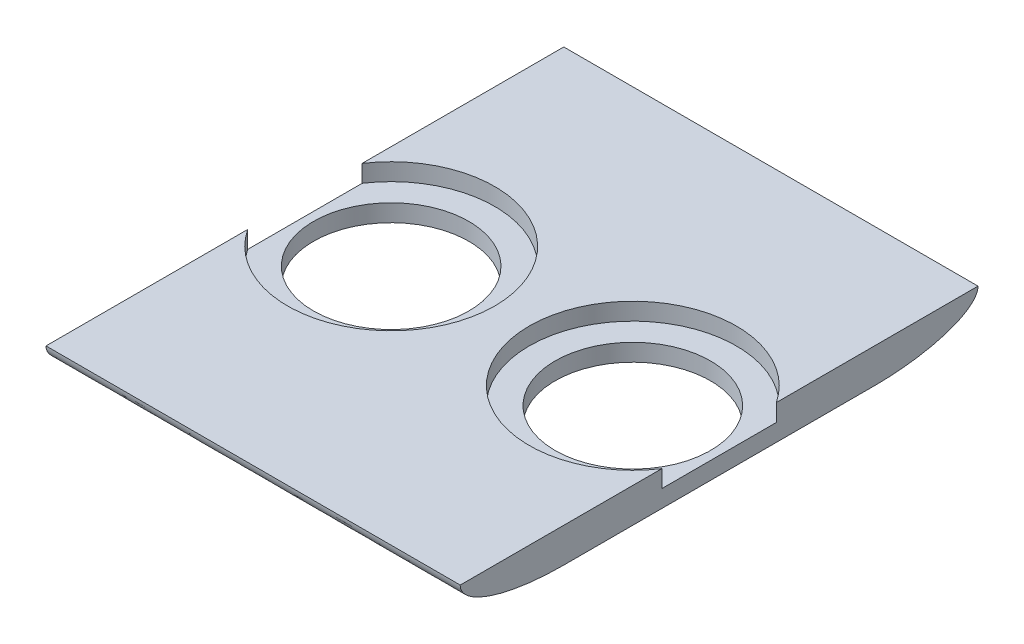
ISO-10303-21;
HEADER;
FILE_DESCRIPTION(('STEP AP214'),'2;1');
FILE_NAME('part.step','',(''),(''),'','','');
FILE_SCHEMA(('AUTOMOTIVE_DESIGN { 1 0 10303 214 1 1 1 1 }'));
ENDSEC;
DATA;
#1=APPLICATION_CONTEXT('core data for automotive mechanical design processes');
#2=APPLICATION_PROTOCOL_DEFINITION('international standard','automotive_design',2000,#1);
#3=PRODUCT_CONTEXT('',#1,'mechanical');
#4=PRODUCT('Part','Part','',(#3));
#5=PRODUCT_RELATED_PRODUCT_CATEGORY('part','',(#4));
#6=PRODUCT_DEFINITION_FORMATION('','',#4);
#7=PRODUCT_DEFINITION_CONTEXT('part definition',#1,'design');
#8=PRODUCT_DEFINITION('design','',#6,#7);
#9=PRODUCT_DEFINITION_SHAPE('','',#8);
#10=(LENGTH_UNIT() NAMED_UNIT(*) SI_UNIT(.MILLI.,.METRE.));
#11=(NAMED_UNIT(*) PLANE_ANGLE_UNIT() SI_UNIT($,.RADIAN.));
#12=(NAMED_UNIT(*) SI_UNIT($,.STERADIAN.) SOLID_ANGLE_UNIT());
#13=UNCERTAINTY_MEASURE_WITH_UNIT(LENGTH_MEASURE(1.E-05),#10,'distance_accuracy_value','');
#14=(GEOMETRIC_REPRESENTATION_CONTEXT(3) GLOBAL_UNCERTAINTY_ASSIGNED_CONTEXT((#13)) GLOBAL_UNIT_ASSIGNED_CONTEXT((#10,
#11,#12)) REPRESENTATION_CONTEXT('',''));
#15=CARTESIAN_POINT('',(0.,0.,0.));
#16=DIRECTION('',(0.,0.,1.));
#17=DIRECTION('',(1.,0.,0.));
#18=AXIS2_PLACEMENT_3D('',#15,#16,#17);
#19=CARTESIAN_POINT('',(60.,10.,75.));
#20=DIRECTION('',(-1.,0.,0.));
#21=DIRECTION('',(0.,0.,1.));
#22=AXIS2_PLACEMENT_3D('',#19,#20,#21);
#23=PLANE('',#22);
#24=DIRECTION('',(0.,0.,-1.));
#25=VECTOR('',#24,1.);
#26=CARTESIAN_POINT('',(60.,0.,75.));
#27=LINE('',#26,#25);
#28=CARTESIAN_POINT('',(60.,0.,45.));
#29=VERTEX_POINT('',#28);
#30=CARTESIAN_POINT('',(60.,0.,-45.));
#31=VERTEX_POINT('',#30);
#32=EDGE_CURVE('E159',#29,#31,#27,.T.);
#33=ORIENTED_EDGE('',*,*,#32,.T.);
#34=CARTESIAN_POINT('',(60.,10.,-75.));
#35=CARTESIAN_POINT('',(60.,0.,-75.));
#36=CARTESIAN_POINT('',(60.,0.,-45.));
#37=(BOUNDED_CURVE() B_SPLINE_CURVE(2,(#34,#35,#36),.UNSPECIFIED.,.F.,
.F.) B_SPLINE_CURVE_WITH_KNOTS((3,3),(0.,1.),
.UNSPECIFIED.) CURVE() GEOMETRIC_REPRESENTATION_ITEM() RATIONAL_B_SPLINE_CURVE((1.,
0.707106781186548,1.)) REPRESENTATION_ITEM(''));
#38=CARTESIAN_POINT('',(60.,10.,-75.));
#39=VERTEX_POINT('',#38);
#40=EDGE_CURVE('E12',#31,#39,#37,.F.);
#41=ORIENTED_EDGE('',*,*,#40,.T.);
#42=DIRECTION('',(0.,0.,-1.));
#43=VECTOR('',#42,1.);
#44=CARTESIAN_POINT('',(60.,10.,75.));
#45=LINE('',#44,#43);
#46=CARTESIAN_POINT('',(60.,10.,-16.583123951777));
#47=VERTEX_POINT('',#46);
#48=EDGE_CURVE('E158',#47,#39,#45,.T.);
#49=ORIENTED_EDGE('',*,*,#48,.F.);
#50=DIRECTION('',(0.,1.,0.));
#51=VECTOR('',#50,1.);
#52=CARTESIAN_POINT('',(60.,5.,-16.583123951777));
#53=LINE('',#52,#51);
#54=CARTESIAN_POINT('',(60.,5.,-16.583123951777));
#55=VERTEX_POINT('',#54);
#56=EDGE_CURVE('E129',#47,#55,#53,.F.);
#57=ORIENTED_EDGE('',*,*,#56,.T.);
#58=DIRECTION('',(0.,0.,-1.));
#59=VECTOR('',#58,1.);
#60=CARTESIAN_POINT('',(60.,5.,75.));
#61=LINE('',#60,#59);
#62=CARTESIAN_POINT('',(60.,5.,16.583123951777));
#63=VERTEX_POINT('',#62);
#64=EDGE_CURVE('E142',#63,#55,#61,.T.);
#65=ORIENTED_EDGE('',*,*,#64,.F.);
#66=DIRECTION('',(0.,1.,0.));
#67=VECTOR('',#66,1.);
#68=CARTESIAN_POINT('',(60.,5.,16.583123951777));
#69=LINE('',#68,#67);
#70=CARTESIAN_POINT('',(60.,10.,16.583123951777));
#71=VERTEX_POINT('',#70);
#72=EDGE_CURVE('E278',#63,#71,#69,.T.);
#73=ORIENTED_EDGE('',*,*,#72,.T.);
#74=CARTESIAN_POINT('',(60.,10.,75.));
#75=VERTEX_POINT('',#74);
#76=EDGE_CURVE('E254',#75,#71,#45,.T.);
#77=ORIENTED_EDGE('',*,*,#76,.F.);
#78=CARTESIAN_POINT('',(60.,0.,45.));
#79=CARTESIAN_POINT('',(60.,0.,75.));
#80=CARTESIAN_POINT('',(60.,10.,75.));
#81=(BOUNDED_CURVE() B_SPLINE_CURVE(2,(#78,#79,#80),.UNSPECIFIED.,.F.,
.F.) B_SPLINE_CURVE_WITH_KNOTS((3,3),(0.,1.),
.UNSPECIFIED.) CURVE() GEOMETRIC_REPRESENTATION_ITEM() RATIONAL_B_SPLINE_CURVE((1.,
0.707106781186548,1.)) REPRESENTATION_ITEM(''));
#82=EDGE_CURVE('E59',#75,#29,#81,.F.);
#83=ORIENTED_EDGE('',*,*,#82,.T.);
#84=EDGE_LOOP('',(#33,#41,#49,#57,#65,#73,#77,#83));
#85=FACE_BOUND('',#84,.T.);
#86=ADVANCED_FACE('F43',(#85),#23,.F.);
#87=CARTESIAN_POINT('',(-60.,10.,75.));
#88=DIRECTION('',(1.,0.,0.));
#89=DIRECTION('',(0.,0.,-1.));
#90=AXIS2_PLACEMENT_3D('',#87,#88,#89);
#91=PLANE('',#90);
#92=DIRECTION('',(0.,0.,1.));
#93=VECTOR('',#92,1.);
#94=CARTESIAN_POINT('',(-60.,10.,75.));
#95=LINE('',#94,#93);
#96=CARTESIAN_POINT('',(-60.,10.,-75.));
#97=VERTEX_POINT('',#96);
#98=CARTESIAN_POINT('',(-60.,10.,-16.583123951777));
#99=VERTEX_POINT('',#98);
#100=EDGE_CURVE('E171',#97,#99,#95,.T.);
#101=ORIENTED_EDGE('',*,*,#100,.F.);
#102=CARTESIAN_POINT('',(-60.,0.,-45.));
#103=CARTESIAN_POINT('',(-60.,0.,-75.));
#104=CARTESIAN_POINT('',(-60.,10.,-75.));
#105=(BOUNDED_CURVE() B_SPLINE_CURVE(2,(#102,#103,#104),.UNSPECIFIED.,.F.,
.F.) B_SPLINE_CURVE_WITH_KNOTS((3,3),(0.,1.),
.UNSPECIFIED.) CURVE() GEOMETRIC_REPRESENTATION_ITEM() RATIONAL_B_SPLINE_CURVE((1.,
0.707106781186548,1.)) REPRESENTATION_ITEM(''));
#106=CARTESIAN_POINT('',(-60.,0.,-45.));
#107=VERTEX_POINT('',#106);
#108=EDGE_CURVE('E195',#97,#107,#105,.F.);
#109=ORIENTED_EDGE('',*,*,#108,.T.);
#110=DIRECTION('',(0.,0.,1.));
#111=VECTOR('',#110,1.);
#112=CARTESIAN_POINT('',(-60.,0.,75.));
#113=LINE('',#112,#111);
#114=CARTESIAN_POINT('',(-60.,0.,45.));
#115=VERTEX_POINT('',#114);
#116=EDGE_CURVE('E153',#107,#115,#113,.T.);
#117=ORIENTED_EDGE('',*,*,#116,.T.);
#118=CARTESIAN_POINT('',(-60.,10.,75.));
#119=CARTESIAN_POINT('',(-60.,0.,75.));
#120=CARTESIAN_POINT('',(-60.,0.,45.));
#121=(BOUNDED_CURVE() B_SPLINE_CURVE(2,(#118,#119,#120),.UNSPECIFIED.,.F.,
.F.) B_SPLINE_CURVE_WITH_KNOTS((3,3),(0.,1.),
.UNSPECIFIED.) CURVE() GEOMETRIC_REPRESENTATION_ITEM() RATIONAL_B_SPLINE_CURVE((1.,
0.707106781186548,1.)) REPRESENTATION_ITEM(''));
#122=CARTESIAN_POINT('',(-60.,10.,75.));
#123=VERTEX_POINT('',#122);
#124=EDGE_CURVE('E147',#115,#123,#121,.F.);
#125=ORIENTED_EDGE('',*,*,#124,.T.);
#126=CARTESIAN_POINT('',(-60.,10.,16.583123951777));
#127=VERTEX_POINT('',#126);
#128=EDGE_CURVE('E175',#127,#123,#95,.T.);
#129=ORIENTED_EDGE('',*,*,#128,.F.);
#130=DIRECTION('',(0.,1.,0.));
#131=VECTOR('',#130,1.);
#132=CARTESIAN_POINT('',(-60.,5.,16.583123951777));
#133=LINE('',#132,#131);
#134=CARTESIAN_POINT('',(-60.,5.,16.583123951777));
#135=VERTEX_POINT('',#134);
#136=EDGE_CURVE('E130',#127,#135,#133,.F.);
#137=ORIENTED_EDGE('',*,*,#136,.T.);
#138=DIRECTION('',(0.,0.,1.));
#139=VECTOR('',#138,1.);
#140=CARTESIAN_POINT('',(-60.,5.,75.));
#141=LINE('',#140,#139);
#142=CARTESIAN_POINT('',(-60.,5.,-16.583123951777));
#143=VERTEX_POINT('',#142);
#144=EDGE_CURVE('E134',#143,#135,#141,.T.);
#145=ORIENTED_EDGE('',*,*,#144,.F.);
#146=DIRECTION('',(0.,1.,0.));
#147=VECTOR('',#146,1.);
#148=CARTESIAN_POINT('',(-60.,5.,-16.583123951777));
#149=LINE('',#148,#147);
#150=EDGE_CURVE('E117',#143,#99,#149,.T.);
#151=ORIENTED_EDGE('',*,*,#150,.T.);
#152=EDGE_LOOP('',(#101,#109,#117,#125,#129,#137,#145,#151));
#153=FACE_BOUND('',#152,.T.);
#154=ADVANCED_FACE('F139',(#153),#91,.F.);
#155=CARTESIAN_POINT('',(0.,10.,0.));
#156=DIRECTION('',(0.,-1.,0.));
#157=DIRECTION('',(0.,0.,-1.));
#158=AXIS2_PLACEMENT_3D('',#155,#156,#157);
#159=PLANE('',#158);
#160=ORIENTED_EDGE('',*,*,#76,.T.);
#161=CARTESIAN_POINT('',(35.,10.,0.));
#162=DIRECTION('',(0.,-1.,0.));
#163=DIRECTION('',(0.,0.,-1.));
#164=AXIS2_PLACEMENT_3D('',#161,#162,#163);
#165=CIRCLE('',#164,30.);
#166=EDGE_CURVE('E143',#71,#47,#165,.T.);
#167=ORIENTED_EDGE('',*,*,#166,.T.);
#168=ORIENTED_EDGE('',*,*,#48,.T.);
#169=CARTESIAN_POINT('',(-66.,10.,-75.));
#170=CARTESIAN_POINT('',(-22.,10.,-75.));
#171=CARTESIAN_POINT('',(22.,10.,-75.));
#172=CARTESIAN_POINT('',(66.,10.,-75.));
#173=(BOUNDED_CURVE() B_SPLINE_CURVE(3,(#169,#170,#171,#172),.UNSPECIFIED.,.F.,
.F.) B_SPLINE_CURVE_WITH_KNOTS((4,4),(-0.006,0.126),
.UNSPECIFIED.) CURVE() GEOMETRIC_REPRESENTATION_ITEM() RATIONAL_B_SPLINE_CURVE((1.,1.,1.,1.)) REPRESENTATION_ITEM(''));
#174=EDGE_CURVE('E179',#39,#97,#173,.F.);
#175=ORIENTED_EDGE('',*,*,#174,.T.);
#176=ORIENTED_EDGE('',*,*,#100,.T.);
#177=CARTESIAN_POINT('',(-35.,10.,0.));
#178=DIRECTION('',(0.,-1.,0.));
#179=DIRECTION('',(0.,0.,-1.));
#180=AXIS2_PLACEMENT_3D('',#177,#178,#179);
#181=CIRCLE('',#180,30.);
#182=EDGE_CURVE('E123',#99,#127,#181,.T.);
#183=ORIENTED_EDGE('',*,*,#182,.T.);
#184=ORIENTED_EDGE('',*,*,#128,.T.);
#185=CARTESIAN_POINT('',(66.,10.,75.));
#186=CARTESIAN_POINT('',(21.9999999999999,10.,75.));
#187=CARTESIAN_POINT('',(-22.,10.,75.));
#188=CARTESIAN_POINT('',(-66.,10.,75.));
#189=(BOUNDED_CURVE() B_SPLINE_CURVE(3,(#185,#186,#187,#188),.UNSPECIFIED.,.F.,
.F.) B_SPLINE_CURVE_WITH_KNOTS((4,4),(-0.126,0.006),
.UNSPECIFIED.) CURVE() GEOMETRIC_REPRESENTATION_ITEM() RATIONAL_B_SPLINE_CURVE((1.,1.,1.,1.)) REPRESENTATION_ITEM(''));
#190=EDGE_CURVE('E166',#123,#75,#189,.F.);
#191=ORIENTED_EDGE('',*,*,#190,.T.);
#192=EDGE_LOOP('',(#160,#167,#168,#175,#176,#183,#184,#191));
#193=FACE_BOUND('',#192,.T.);
#194=ADVANCED_FACE('F273',(#193),#159,.F.);
#195=CARTESIAN_POINT('',(0.,0.,0.));
#196=DIRECTION('',(0.,-1.,0.));
#197=DIRECTION('',(0.,0.,-1.));
#198=AXIS2_PLACEMENT_3D('',#195,#196,#197);
#199=PLANE('',#198);
#200=CARTESIAN_POINT('',(-35.,0.,0.));
#201=DIRECTION('',(0.,1.,0.));
#202=DIRECTION('',(0.,0.,1.));
#203=AXIS2_PLACEMENT_3D('',#200,#201,#202);
#204=CIRCLE('',#203,22.5);
#205=CARTESIAN_POINT('',(-35.,0.,22.5));
#206=VERTEX_POINT('',#205);
#207=EDGE_CURVE('E137',#206,#206,#204,.T.);
#208=ORIENTED_EDGE('',*,*,#207,.T.);
#209=EDGE_LOOP('',(#208));
#210=FACE_BOUND('',#209,.T.);
#211=CARTESIAN_POINT('',(35.,0.,0.));
#212=DIRECTION('',(0.,1.,0.));
#213=DIRECTION('',(0.,0.,1.));
#214=AXIS2_PLACEMENT_3D('',#211,#212,#213);
#215=CIRCLE('',#214,22.5);
#216=CARTESIAN_POINT('',(35.,0.,22.5));
#217=VERTEX_POINT('',#216);
#218=EDGE_CURVE('E294',#217,#217,#215,.T.);
#219=ORIENTED_EDGE('',*,*,#218,.T.);
#220=EDGE_LOOP('',(#219));
#221=FACE_BOUND('',#220,.T.);
#222=ORIENTED_EDGE('',*,*,#116,.F.);
#223=CARTESIAN_POINT('',(66.,0.,-45.));
#224=CARTESIAN_POINT('',(22.,0.,-45.));
#225=CARTESIAN_POINT('',(-22.,0.,-45.));
#226=CARTESIAN_POINT('',(-66.,0.,-45.));
#227=(BOUNDED_CURVE() B_SPLINE_CURVE(3,(#223,#224,#225,#226),.UNSPECIFIED.,.F.,
.F.) B_SPLINE_CURVE_WITH_KNOTS((4,4),(-0.00600000000000001,0.126),
.UNSPECIFIED.) CURVE() GEOMETRIC_REPRESENTATION_ITEM() RATIONAL_B_SPLINE_CURVE((1.,1.,1.,1.)) REPRESENTATION_ITEM(''));
#228=EDGE_CURVE('E66',#107,#31,#227,.F.);
#229=ORIENTED_EDGE('',*,*,#228,.T.);
#230=ORIENTED_EDGE('',*,*,#32,.F.);
#231=CARTESIAN_POINT('',(-66.,0.,45.));
#232=CARTESIAN_POINT('',(-22.,0.,45.));
#233=CARTESIAN_POINT('',(21.9999999999999,0.,45.));
#234=CARTESIAN_POINT('',(66.,0.,45.));
#235=(BOUNDED_CURVE() B_SPLINE_CURVE(3,(#231,#232,#233,#234),.UNSPECIFIED.,.F.,
.F.) B_SPLINE_CURVE_WITH_KNOTS((4,4),(-0.126,0.00600000000000001),
.UNSPECIFIED.) CURVE() GEOMETRIC_REPRESENTATION_ITEM() RATIONAL_B_SPLINE_CURVE((1.,1.,1.,1.)) REPRESENTATION_ITEM(''));
#236=EDGE_CURVE('E201',#29,#115,#235,.F.);
#237=ORIENTED_EDGE('',*,*,#236,.T.);
#238=EDGE_LOOP('',(#222,#229,#230,#237));
#239=FACE_BOUND('',#238,.T.);
#240=ADVANCED_FACE('F202',(#210,#221,#239),#199,.T.);
#241=CARTESIAN_POINT('',(-35.,5.,0.));
#242=DIRECTION('',(0.,1.,0.));
#243=DIRECTION('',(0.,0.,1.));
#244=AXIS2_PLACEMENT_3D('',#241,#242,#243);
#245=PLANE('',#244);
#246=CARTESIAN_POINT('',(-35.,5.,0.));
#247=DIRECTION('',(0.,1.,0.));
#248=DIRECTION('',(0.,0.,1.));
#249=AXIS2_PLACEMENT_3D('',#246,#247,#248);
#250=CIRCLE('',#249,22.5);
#251=CARTESIAN_POINT('',(-35.,5.,22.5));
#252=VERTEX_POINT('',#251);
#253=EDGE_CURVE('E298',#252,#252,#250,.T.);
#254=ORIENTED_EDGE('',*,*,#253,.F.);
#255=EDGE_LOOP('',(#254));
#256=FACE_BOUND('',#255,.T.);
#257=ORIENTED_EDGE('',*,*,#144,.T.);
#258=CARTESIAN_POINT('',(-35.,5.,0.));
#259=DIRECTION('',(0.,1.,0.));
#260=DIRECTION('',(0.,0.,1.));
#261=AXIS2_PLACEMENT_3D('',#258,#259,#260);
#262=CIRCLE('',#261,30.);
#263=EDGE_CURVE('E120',#135,#143,#262,.T.);
#264=ORIENTED_EDGE('',*,*,#263,.T.);
#265=EDGE_LOOP('',(#257,#264));
#266=FACE_BOUND('',#265,.T.);
#267=ADVANCED_FACE('F133',(#256,#266),#245,.T.);
#268=CARTESIAN_POINT('',(-35.,5.,0.));
#269=DIRECTION('',(0.,1.,0.));
#270=DIRECTION('',(0.,0.,1.));
#271=AXIS2_PLACEMENT_3D('',#268,#269,#270);
#272=CYLINDRICAL_SURFACE('',#271,30.);
#273=ORIENTED_EDGE('',*,*,#263,.F.);
#274=ORIENTED_EDGE('',*,*,#136,.F.);
#275=ORIENTED_EDGE('',*,*,#182,.F.);
#276=ORIENTED_EDGE('',*,*,#150,.F.);
#277=EDGE_LOOP('',(#273,#274,#275,#276));
#278=FACE_BOUND('',#277,.T.);
#279=ADVANCED_FACE('F119',(#278),#272,.F.);
#280=CARTESIAN_POINT('',(35.,5.,0.));
#281=DIRECTION('',(0.,1.,0.));
#282=DIRECTION('',(0.,0.,1.));
#283=AXIS2_PLACEMENT_3D('',#280,#281,#282);
#284=PLANE('',#283);
#285=CARTESIAN_POINT('',(35.,5.,0.));
#286=DIRECTION('',(0.,1.,0.));
#287=DIRECTION('',(0.,0.,1.));
#288=AXIS2_PLACEMENT_3D('',#285,#286,#287);
#289=CIRCLE('',#288,22.5);
#290=CARTESIAN_POINT('',(35.,5.,22.5));
#291=VERTEX_POINT('',#290);
#292=EDGE_CURVE('E290',#291,#291,#289,.T.);
#293=ORIENTED_EDGE('',*,*,#292,.F.);
#294=EDGE_LOOP('',(#293));
#295=FACE_BOUND('',#294,.T.);
#296=ORIENTED_EDGE('',*,*,#64,.T.);
#297=CARTESIAN_POINT('',(35.,5.,0.));
#298=DIRECTION('',(0.,1.,0.));
#299=DIRECTION('',(0.,0.,1.));
#300=AXIS2_PLACEMENT_3D('',#297,#298,#299);
#301=CIRCLE('',#300,30.);
#302=EDGE_CURVE('E136',#55,#63,#301,.T.);
#303=ORIENTED_EDGE('',*,*,#302,.T.);
#304=EDGE_LOOP('',(#296,#303));
#305=FACE_BOUND('',#304,.T.);
#306=ADVANCED_FACE('F320',(#295,#305),#284,.T.);
#307=CARTESIAN_POINT('',(35.,5.,0.));
#308=DIRECTION('',(0.,1.,0.));
#309=DIRECTION('',(0.,0.,1.));
#310=AXIS2_PLACEMENT_3D('',#307,#308,#309);
#311=CYLINDRICAL_SURFACE('',#310,30.);
#312=ORIENTED_EDGE('',*,*,#302,.F.);
#313=ORIENTED_EDGE('',*,*,#56,.F.);
#314=ORIENTED_EDGE('',*,*,#166,.F.);
#315=ORIENTED_EDGE('',*,*,#72,.F.);
#316=EDGE_LOOP('',(#312,#313,#314,#315));
#317=FACE_BOUND('',#316,.T.);
#318=ADVANCED_FACE('F277',(#317),#311,.F.);
#319=CARTESIAN_POINT('',(35.,0.,0.));
#320=DIRECTION('',(0.,1.,0.));
#321=DIRECTION('',(0.,0.,1.));
#322=AXIS2_PLACEMENT_3D('',#319,#320,#321);
#323=CYLINDRICAL_SURFACE('',#322,22.5);
#324=ORIENTED_EDGE('',*,*,#218,.F.);
#325=EDGE_LOOP('',(#324));
#326=FACE_BOUND('',#325,.T.);
#327=ORIENTED_EDGE('',*,*,#292,.T.);
#328=EDGE_LOOP('',(#327));
#329=FACE_BOUND('',#328,.T.);
#330=ADVANCED_FACE('F310',(#326,#329),#323,.F.);
#331=CARTESIAN_POINT('',(-35.,0.,0.));
#332=DIRECTION('',(0.,1.,0.));
#333=DIRECTION('',(0.,0.,1.));
#334=AXIS2_PLACEMENT_3D('',#331,#332,#333);
#335=CYLINDRICAL_SURFACE('',#334,22.5);
#336=ORIENTED_EDGE('',*,*,#207,.F.);
#337=EDGE_LOOP('',(#336));
#338=FACE_BOUND('',#337,.T.);
#339=ORIENTED_EDGE('',*,*,#253,.T.);
#340=EDGE_LOOP('',(#339));
#341=FACE_BOUND('',#340,.T.);
#342=ADVANCED_FACE('F230',(#338,#341),#335,.F.);
#343=CARTESIAN_POINT('',(-66.,0.,-45.));
#344=CARTESIAN_POINT('',(-22.,0.,-45.));
#345=CARTESIAN_POINT('',(22.,0.,-45.));
#346=CARTESIAN_POINT('',(66.,0.,-45.));
#347=CARTESIAN_POINT('',(-66.,0.,-75.));
#348=CARTESIAN_POINT('',(-22.,0.,-75.));
#349=CARTESIAN_POINT('',(22.,0.,-75.));
#350=CARTESIAN_POINT('',(66.,0.,-75.));
#351=CARTESIAN_POINT('',(-66.,10.,-75.));
#352=CARTESIAN_POINT('',(-22.,10.,-75.));
#353=CARTESIAN_POINT('',(22.,10.,-75.));
#354=CARTESIAN_POINT('',(66.,10.,-75.));
#355=(BOUNDED_SURFACE() B_SPLINE_SURFACE(2,3,((#343,#344,#345,#346),(#347,#348,#349,#350),(#351,
#352,#353,#354)),.UNSPECIFIED.,.F.,.F.,.F.) B_SPLINE_SURFACE_WITH_KNOTS((3,3),(4,4),(0.,1.),
(-0.006,0.126),.UNSPECIFIED.) GEOMETRIC_REPRESENTATION_ITEM() RATIONAL_B_SPLINE_SURFACE(((1.,1.,
1.,1.),(0.707106781186548,0.707106781186548,0.707106781186548,0.707106781186548),(1.,1.,1.,1.))) REPRESENTATION_ITEM('') SURFACE());
#356=ORIENTED_EDGE('',*,*,#40,.F.);
#357=ORIENTED_EDGE('',*,*,#228,.F.);
#358=ORIENTED_EDGE('',*,*,#108,.F.);
#359=ORIENTED_EDGE('',*,*,#174,.F.);
#360=EDGE_LOOP('',(#356,#357,#358,#359));
#361=FACE_BOUND('',#360,.T.);
#362=ADVANCED_FACE('F206',(#361),#355,.T.);
#363=CARTESIAN_POINT('',(66.,0.,45.));
#364=CARTESIAN_POINT('',(21.9999999999999,0.,45.));
#365=CARTESIAN_POINT('',(-22.,0.,45.));
#366=CARTESIAN_POINT('',(-66.,0.,45.));
#367=CARTESIAN_POINT('',(66.,0.,75.));
#368=CARTESIAN_POINT('',(21.9999999999999,0.,75.));
#369=CARTESIAN_POINT('',(-22.,0.,75.));
#370=CARTESIAN_POINT('',(-66.,0.,75.));
#371=CARTESIAN_POINT('',(66.,10.,75.));
#372=CARTESIAN_POINT('',(21.9999999999999,10.,75.));
#373=CARTESIAN_POINT('',(-22.,10.,75.));
#374=CARTESIAN_POINT('',(-66.,10.,75.));
#375=(BOUNDED_SURFACE() B_SPLINE_SURFACE(2,3,((#363,#364,#365,#366),(#367,#368,#369,#370),(#371,
#372,#373,#374)),.UNSPECIFIED.,.F.,.F.,.F.) B_SPLINE_SURFACE_WITH_KNOTS((3,3),(4,4),(0.,1.),
(-0.126,0.006),.UNSPECIFIED.) GEOMETRIC_REPRESENTATION_ITEM() RATIONAL_B_SPLINE_SURFACE(((1.,1.,
1.,1.),(0.707106781186548,0.707106781186548,0.707106781186548,0.707106781186548),(1.,1.,1.,1.))) REPRESENTATION_ITEM('') SURFACE());
#376=ORIENTED_EDGE('',*,*,#124,.F.);
#377=ORIENTED_EDGE('',*,*,#236,.F.);
#378=ORIENTED_EDGE('',*,*,#82,.F.);
#379=ORIENTED_EDGE('',*,*,#190,.F.);
#380=EDGE_LOOP('',(#376,#377,#378,#379));
#381=FACE_BOUND('',#380,.T.);
#382=ADVANCED_FACE('F46',(#381),#375,.T.);
#383=CLOSED_SHELL('',(#86,#154,#194,#240,#267,#279,#306,#318,#330,#342,#362,#382));
#384=MANIFOLD_SOLID_BREP('B2',#383);
#385=ADVANCED_BREP_SHAPE_REPRESENTATION('',(#18,#384),#14);
#386=SHAPE_DEFINITION_REPRESENTATION(#9,#385);
ENDSEC;
END-ISO-10303-21;
